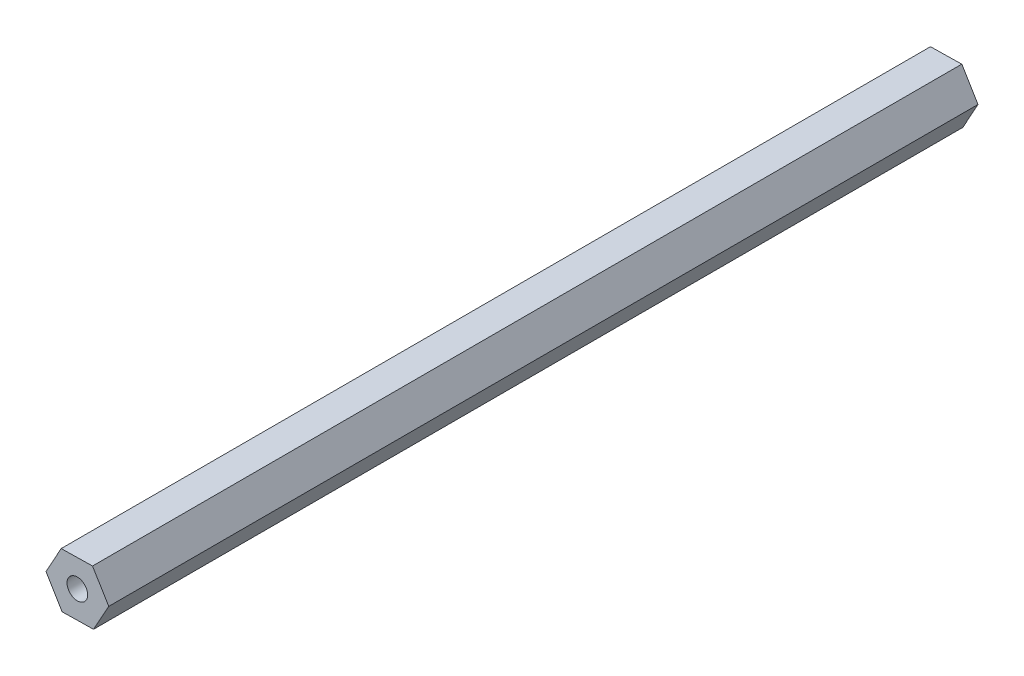
ISO-10303-21;
HEADER;
FILE_DESCRIPTION(('STEP AP214'),'2;1');
FILE_NAME('part.step','',(''),(''),'','','');
FILE_SCHEMA(('AUTOMOTIVE_DESIGN { 1 0 10303 214 1 1 1 1 }'));
ENDSEC;
DATA;
#1=APPLICATION_CONTEXT('core data for automotive mechanical design processes');
#2=APPLICATION_PROTOCOL_DEFINITION('international standard','automotive_design',2000,#1);
#3=PRODUCT_CONTEXT('',#1,'mechanical');
#4=PRODUCT('Part','Part','',(#3));
#5=PRODUCT_RELATED_PRODUCT_CATEGORY('part','',(#4));
#6=PRODUCT_DEFINITION_FORMATION('','',#4);
#7=PRODUCT_DEFINITION_CONTEXT('part definition',#1,'design');
#8=PRODUCT_DEFINITION('design','',#6,#7);
#9=PRODUCT_DEFINITION_SHAPE('','',#8);
#10=(LENGTH_UNIT() NAMED_UNIT(*) SI_UNIT(.MILLI.,.METRE.));
#11=(NAMED_UNIT(*) PLANE_ANGLE_UNIT() SI_UNIT($,.RADIAN.));
#12=(NAMED_UNIT(*) SI_UNIT($,.STERADIAN.) SOLID_ANGLE_UNIT());
#13=UNCERTAINTY_MEASURE_WITH_UNIT(LENGTH_MEASURE(1.E-05),#10,'distance_accuracy_value','');
#14=(GEOMETRIC_REPRESENTATION_CONTEXT(3) GLOBAL_UNCERTAINTY_ASSIGNED_CONTEXT((#13)) GLOBAL_UNIT_ASSIGNED_CONTEXT((#10,
#11,#12)) REPRESENTATION_CONTEXT('',''));
#15=CARTESIAN_POINT('',(0.,0.,0.));
#16=DIRECTION('',(0.,0.,1.));
#17=DIRECTION('',(1.,0.,0.));
#18=AXIS2_PLACEMENT_3D('',#15,#16,#17);
#19=CARTESIAN_POINT('',(0.,0.,203.2));
#20=DIRECTION('',(0.,0.,1.));
#21=DIRECTION('',(1.,0.,0.));
#22=AXIS2_PLACEMENT_3D('',#19,#20,#21);
#23=PLANE('',#22);
#24=DIRECTION('',(0.99982431701788,0.0187439350118879,0.));
#25=VECTOR('',#24,1.);
#26=CARTESIAN_POINT('',(-3.54650613761057,-6.41760294418593,203.2));
#27=LINE('',#26,#25);
#28=CARTESIAN_POINT('',(-3.54650613761057,-6.41760294418593,203.2));
#29=VERTEX_POINT('',#28);
#30=CARTESIAN_POINT('',(3.78455411226153,-6.28016588194114,203.2));
#31=VERTEX_POINT('',#30);
#32=EDGE_CURVE('E135',#29,#31,#27,.T.);
#33=ORIENTED_EDGE('',*,*,#32,.T.);
#34=DIRECTION('',(0.483679434621761,0.875245225364854,0.));
#35=VECTOR('',#34,1.);
#36=CARTESIAN_POINT('',(3.78455411226153,-6.28016588194114,203.2));
#37=LINE('',#36,#35);
#38=CARTESIAN_POINT('',(7.33106024987211,0.137437062244801,203.2));
#39=VERTEX_POINT('',#38);
#40=EDGE_CURVE('E93',#31,#39,#37,.T.);
#41=ORIENTED_EDGE('',*,*,#40,.T.);
#42=DIRECTION('',(-0.516144882396119,0.856501290352966,0.));
#43=VECTOR('',#42,1.);
#44=CARTESIAN_POINT('',(7.33106024987211,0.137437062244801,203.2));
#45=LINE('',#44,#43);
#46=CARTESIAN_POINT('',(3.54650613761058,6.41760294418593,203.2));
#47=VERTEX_POINT('',#46);
#48=EDGE_CURVE('E106',#39,#47,#45,.T.);
#49=ORIENTED_EDGE('',*,*,#48,.T.);
#50=DIRECTION('',(-0.99982431701788,-0.0187439350118874,0.));
#51=VECTOR('',#50,1.);
#52=CARTESIAN_POINT('',(3.54650613761058,6.41760294418593,203.2));
#53=LINE('',#52,#51);
#54=CARTESIAN_POINT('',(-3.78455411226154,6.28016588194115,203.2));
#55=VERTEX_POINT('',#54);
#56=EDGE_CURVE('E100',#47,#55,#53,.T.);
#57=ORIENTED_EDGE('',*,*,#56,.T.);
#58=DIRECTION('',(-0.483679434621761,-0.875245225364854,0.));
#59=VECTOR('',#58,1.);
#60=CARTESIAN_POINT('',(-3.78455411226154,6.28016588194115,203.2));
#61=LINE('',#60,#59);
#62=CARTESIAN_POINT('',(-7.33106024987211,-0.13743706224478,203.2));
#63=VERTEX_POINT('',#62);
#64=EDGE_CURVE('E104',#55,#63,#61,.T.);
#65=ORIENTED_EDGE('',*,*,#64,.T.);
#66=DIRECTION('',(0.516144882396119,-0.856501290352966,0.));
#67=VECTOR('',#66,1.);
#68=CARTESIAN_POINT('',(-7.33106024987211,-0.13743706224478,203.2));
#69=LINE('',#68,#67);
#70=EDGE_CURVE('E56',#63,#29,#69,.T.);
#71=ORIENTED_EDGE('',*,*,#70,.T.);
#72=EDGE_LOOP('',(#33,#41,#49,#57,#65,#71));
#73=FACE_BOUND('',#72,.T.);
#74=CARTESIAN_POINT('',(0.,0.,203.2));
#75=DIRECTION('',(0.,0.,1.));
#76=DIRECTION('',(1.,0.,0.));
#77=AXIS2_PLACEMENT_3D('',#74,#75,#76);
#78=CIRCLE('',#77,2.413);
#79=CARTESIAN_POINT('',(2.413,0.,203.2));
#80=VERTEX_POINT('',#79);
#81=EDGE_CURVE('E128',#80,#80,#78,.T.);
#82=ORIENTED_EDGE('',*,*,#81,.F.);
#83=EDGE_LOOP('',(#82));
#84=FACE_BOUND('',#83,.T.);
#85=ADVANCED_FACE('F39',(#73,#84),#23,.T.);
#86=CARTESIAN_POINT('',(0.,0.,0.));
#87=DIRECTION('',(0.,0.,1.));
#88=DIRECTION('',(1.,0.,0.));
#89=AXIS2_PLACEMENT_3D('',#86,#87,#88);
#90=PLANE('',#89);
#91=DIRECTION('',(0.99982431701788,0.0187439350118879,0.));
#92=VECTOR('',#91,1.);
#93=CARTESIAN_POINT('',(-3.54650613761057,-6.41760294418593,0.));
#94=LINE('',#93,#92);
#95=CARTESIAN_POINT('',(-3.54650613761057,-6.41760294418593,0.));
#96=VERTEX_POINT('',#95);
#97=CARTESIAN_POINT('',(3.78455411226153,-6.28016588194114,0.));
#98=VERTEX_POINT('',#97);
#99=EDGE_CURVE('E124',#96,#98,#94,.T.);
#100=ORIENTED_EDGE('',*,*,#99,.F.);
#101=DIRECTION('',(0.516144882396119,-0.856501290352966,0.));
#102=VECTOR('',#101,1.);
#103=CARTESIAN_POINT('',(-7.33106024987211,-0.13743706224478,0.));
#104=LINE('',#103,#102);
#105=CARTESIAN_POINT('',(-7.33106024987211,-0.13743706224478,0.));
#106=VERTEX_POINT('',#105);
#107=EDGE_CURVE('E85',#106,#96,#104,.T.);
#108=ORIENTED_EDGE('',*,*,#107,.F.);
#109=DIRECTION('',(-0.483679434621761,-0.875245225364854,0.));
#110=VECTOR('',#109,1.);
#111=CARTESIAN_POINT('',(-3.78455411226154,6.28016588194115,0.));
#112=LINE('',#111,#110);
#113=CARTESIAN_POINT('',(-3.78455411226154,6.28016588194115,0.));
#114=VERTEX_POINT('',#113);
#115=EDGE_CURVE('E79',#114,#106,#112,.T.);
#116=ORIENTED_EDGE('',*,*,#115,.F.);
#117=DIRECTION('',(-0.99982431701788,-0.0187439350118874,0.));
#118=VECTOR('',#117,1.);
#119=CARTESIAN_POINT('',(3.54650613761058,6.41760294418593,0.));
#120=LINE('',#119,#118);
#121=CARTESIAN_POINT('',(3.54650613761058,6.41760294418593,0.));
#122=VERTEX_POINT('',#121);
#123=EDGE_CURVE('E114',#122,#114,#120,.T.);
#124=ORIENTED_EDGE('',*,*,#123,.F.);
#125=DIRECTION('',(-0.516144882396119,0.856501290352966,0.));
#126=VECTOR('',#125,1.);
#127=CARTESIAN_POINT('',(7.33106024987211,0.137437062244801,0.));
#128=LINE('',#127,#126);
#129=CARTESIAN_POINT('',(7.33106024987211,0.137437062244801,0.));
#130=VERTEX_POINT('',#129);
#131=EDGE_CURVE('E130',#130,#122,#128,.T.);
#132=ORIENTED_EDGE('',*,*,#131,.F.);
#133=DIRECTION('',(0.483679434621761,0.875245225364854,0.));
#134=VECTOR('',#133,1.);
#135=CARTESIAN_POINT('',(3.78455411226153,-6.28016588194114,0.));
#136=LINE('',#135,#134);
#137=EDGE_CURVE('E127',#98,#130,#136,.T.);
#138=ORIENTED_EDGE('',*,*,#137,.F.);
#139=EDGE_LOOP('',(#100,#108,#116,#124,#132,#138));
#140=FACE_BOUND('',#139,.T.);
#141=CARTESIAN_POINT('',(0.,0.,0.));
#142=DIRECTION('',(0.,0.,1.));
#143=DIRECTION('',(1.,0.,0.));
#144=AXIS2_PLACEMENT_3D('',#141,#142,#143);
#145=CIRCLE('',#144,2.413);
#146=CARTESIAN_POINT('',(2.413,0.,0.));
#147=VERTEX_POINT('',#146);
#148=EDGE_CURVE('E228',#147,#147,#145,.T.);
#149=ORIENTED_EDGE('',*,*,#148,.T.);
#150=EDGE_LOOP('',(#149));
#151=FACE_BOUND('',#150,.T.);
#152=ADVANCED_FACE('F144',(#140,#151),#90,.F.);
#153=CARTESIAN_POINT('',(-3.54650613761057,-6.41760294418593,203.2));
#154=DIRECTION('',(-0.0187439350118879,0.99982431701788,0.));
#155=DIRECTION('',(-0.99982431701788,-0.0187439350118879,0.));
#156=AXIS2_PLACEMENT_3D('',#153,#154,#155);
#157=PLANE('',#156);
#158=ORIENTED_EDGE('',*,*,#99,.T.);
#159=DIRECTION('',(0.,0.,-1.));
#160=VECTOR('',#159,1.);
#161=CARTESIAN_POINT('',(3.78455411226153,-6.28016588194114,203.2));
#162=LINE('',#161,#160);
#163=EDGE_CURVE('E11',#31,#98,#162,.T.);
#164=ORIENTED_EDGE('',*,*,#163,.F.);
#165=ORIENTED_EDGE('',*,*,#32,.F.);
#166=DIRECTION('',(0.,0.,-1.));
#167=VECTOR('',#166,1.);
#168=CARTESIAN_POINT('',(-3.54650613761057,-6.41760294418593,203.2));
#169=LINE('',#168,#167);
#170=EDGE_CURVE('E120',#29,#96,#169,.T.);
#171=ORIENTED_EDGE('',*,*,#170,.T.);
#172=EDGE_LOOP('',(#158,#164,#165,#171));
#173=FACE_BOUND('',#172,.T.);
#174=ADVANCED_FACE('F41',(#173),#157,.F.);
#175=CARTESIAN_POINT('',(3.78455411226153,-6.28016588194114,203.2));
#176=DIRECTION('',(-0.875245225364854,0.483679434621761,0.));
#177=DIRECTION('',(-0.483679434621761,-0.875245225364854,0.));
#178=AXIS2_PLACEMENT_3D('',#175,#176,#177);
#179=PLANE('',#178);
#180=ORIENTED_EDGE('',*,*,#137,.T.);
#181=DIRECTION('',(0.,0.,-1.));
#182=VECTOR('',#181,1.);
#183=CARTESIAN_POINT('',(7.33106024987211,0.137437062244801,203.2));
#184=LINE('',#183,#182);
#185=EDGE_CURVE('E48',#39,#130,#184,.T.);
#186=ORIENTED_EDGE('',*,*,#185,.F.);
#187=ORIENTED_EDGE('',*,*,#40,.F.);
#188=ORIENTED_EDGE('',*,*,#163,.T.);
#189=EDGE_LOOP('',(#180,#186,#187,#188));
#190=FACE_BOUND('',#189,.T.);
#191=ADVANCED_FACE('F169',(#190),#179,.F.);
#192=CARTESIAN_POINT('',(7.33106024987211,0.137437062244801,203.2));
#193=DIRECTION('',(-0.856501290352966,-0.516144882396119,0.));
#194=DIRECTION('',(0.516144882396119,-0.856501290352967,0.));
#195=AXIS2_PLACEMENT_3D('',#192,#193,#194);
#196=PLANE('',#195);
#197=ORIENTED_EDGE('',*,*,#131,.T.);
#198=DIRECTION('',(0.,0.,-1.));
#199=VECTOR('',#198,1.);
#200=CARTESIAN_POINT('',(3.54650613761058,6.41760294418593,203.2));
#201=LINE('',#200,#199);
#202=EDGE_CURVE('E115',#47,#122,#201,.T.);
#203=ORIENTED_EDGE('',*,*,#202,.F.);
#204=ORIENTED_EDGE('',*,*,#48,.F.);
#205=ORIENTED_EDGE('',*,*,#185,.T.);
#206=EDGE_LOOP('',(#197,#203,#204,#205));
#207=FACE_BOUND('',#206,.T.);
#208=ADVANCED_FACE('F141',(#207),#196,.F.);
#209=CARTESIAN_POINT('',(3.54650613761058,6.41760294418593,203.2));
#210=DIRECTION('',(0.0187439350118874,-0.99982431701788,0.));
#211=DIRECTION('',(0.99982431701788,0.0187439350118874,0.));
#212=AXIS2_PLACEMENT_3D('',#209,#210,#211);
#213=PLANE('',#212);
#214=ORIENTED_EDGE('',*,*,#123,.T.);
#215=DIRECTION('',(0.,0.,-1.));
#216=VECTOR('',#215,1.);
#217=CARTESIAN_POINT('',(-3.78455411226154,6.28016588194115,203.2));
#218=LINE('',#217,#216);
#219=EDGE_CURVE('E111',#55,#114,#218,.T.);
#220=ORIENTED_EDGE('',*,*,#219,.F.);
#221=ORIENTED_EDGE('',*,*,#56,.F.);
#222=ORIENTED_EDGE('',*,*,#202,.T.);
#223=EDGE_LOOP('',(#214,#220,#221,#222));
#224=FACE_BOUND('',#223,.T.);
#225=ADVANCED_FACE('F112',(#224),#213,.F.);
#226=CARTESIAN_POINT('',(-3.78455411226154,6.28016588194115,203.2));
#227=DIRECTION('',(0.875245225364854,-0.483679434621761,0.));
#228=DIRECTION('',(0.483679434621761,0.875245225364854,0.));
#229=AXIS2_PLACEMENT_3D('',#226,#227,#228);
#230=PLANE('',#229);
#231=ORIENTED_EDGE('',*,*,#115,.T.);
#232=DIRECTION('',(0.,0.,-1.));
#233=VECTOR('',#232,1.);
#234=CARTESIAN_POINT('',(-7.33106024987211,-0.13743706224478,203.2));
#235=LINE('',#234,#233);
#236=EDGE_CURVE('E116',#63,#106,#235,.T.);
#237=ORIENTED_EDGE('',*,*,#236,.F.);
#238=ORIENTED_EDGE('',*,*,#64,.F.);
#239=ORIENTED_EDGE('',*,*,#219,.T.);
#240=EDGE_LOOP('',(#231,#237,#238,#239));
#241=FACE_BOUND('',#240,.T.);
#242=ADVANCED_FACE('F118',(#241),#230,.F.);
#243=CARTESIAN_POINT('',(-7.33106024987211,-0.13743706224478,203.2));
#244=DIRECTION('',(0.856501290352966,0.516144882396119,0.));
#245=DIRECTION('',(-0.516144882396119,0.856501290352966,0.));
#246=AXIS2_PLACEMENT_3D('',#243,#244,#245);
#247=PLANE('',#246);
#248=ORIENTED_EDGE('',*,*,#107,.T.);
#249=ORIENTED_EDGE('',*,*,#170,.F.);
#250=ORIENTED_EDGE('',*,*,#70,.F.);
#251=ORIENTED_EDGE('',*,*,#236,.T.);
#252=EDGE_LOOP('',(#248,#249,#250,#251));
#253=FACE_BOUND('',#252,.T.);
#254=ADVANCED_FACE('F149',(#253),#247,.F.);
#255=CARTESIAN_POINT('',(0.,0.,203.2));
#256=DIRECTION('',(0.,0.,-1.));
#257=DIRECTION('',(-1.,0.,0.));
#258=AXIS2_PLACEMENT_3D('',#255,#256,#257);
#259=CYLINDRICAL_SURFACE('',#258,2.413);
#260=ORIENTED_EDGE('',*,*,#81,.T.);
#261=EDGE_LOOP('',(#260));
#262=FACE_BOUND('',#261,.T.);
#263=ORIENTED_EDGE('',*,*,#148,.F.);
#264=EDGE_LOOP('',(#263));
#265=FACE_BOUND('',#264,.T.);
#266=ADVANCED_FACE('F151',(#262,#265),#259,.F.);
#267=CLOSED_SHELL('',(#85,#152,#174,#191,#208,#225,#242,#254,#266));
#268=MANIFOLD_SOLID_BREP('B2',#267);
#269=ADVANCED_BREP_SHAPE_REPRESENTATION('',(#18,#268),#14);
#270=SHAPE_DEFINITION_REPRESENTATION(#9,#269);
ENDSEC;
END-ISO-10303-21;
